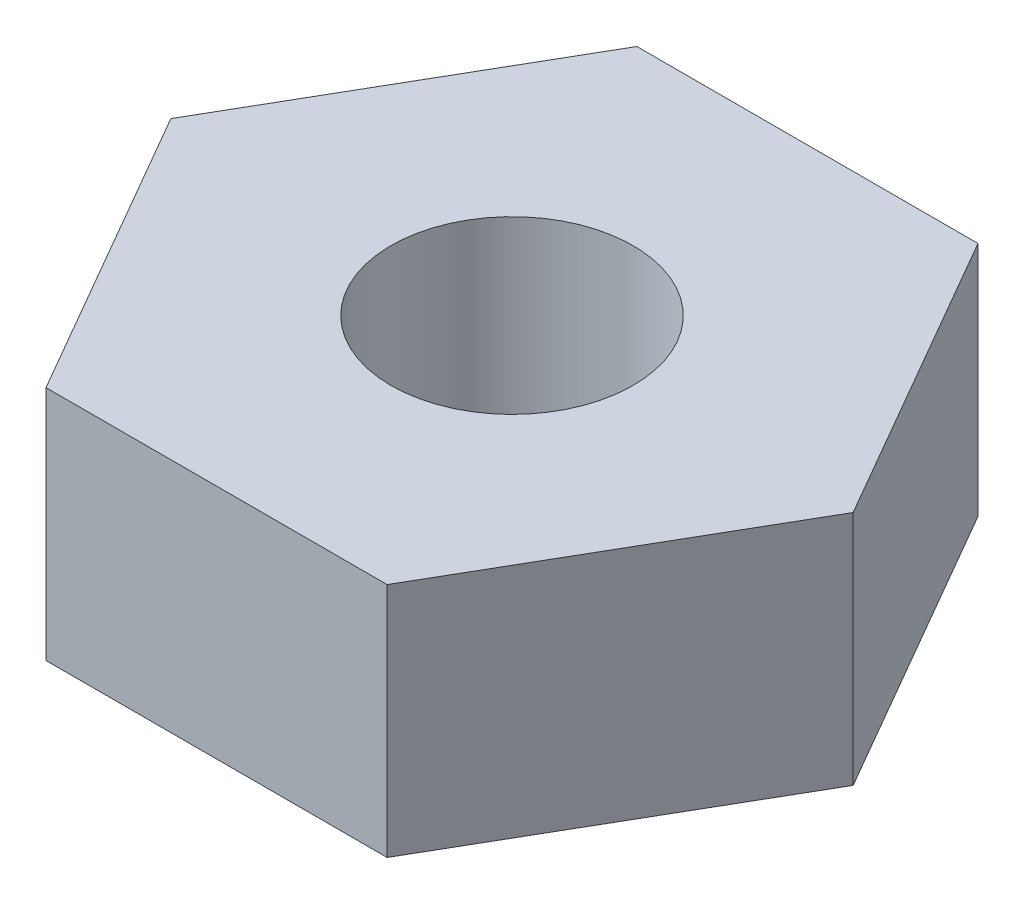
ISO-10303-21;
HEADER;
FILE_DESCRIPTION(('STEP AP214'),'2;1');
FILE_NAME('part.step','',(''),(''),'','','');
FILE_SCHEMA(('AUTOMOTIVE_DESIGN { 1 0 10303 214 1 1 1 1 }'));
ENDSEC;
DATA;
#1=APPLICATION_CONTEXT('core data for automotive mechanical design processes');
#2=APPLICATION_PROTOCOL_DEFINITION('international standard','automotive_design',2000,#1);
#3=PRODUCT_CONTEXT('',#1,'mechanical');
#4=PRODUCT('Part','Part','',(#3));
#5=PRODUCT_RELATED_PRODUCT_CATEGORY('part','',(#4));
#6=PRODUCT_DEFINITION_FORMATION('','',#4);
#7=PRODUCT_DEFINITION_CONTEXT('part definition',#1,'design');
#8=PRODUCT_DEFINITION('design','',#6,#7);
#9=PRODUCT_DEFINITION_SHAPE('','',#8);
#10=(LENGTH_UNIT() NAMED_UNIT(*) SI_UNIT(.MILLI.,.METRE.));
#11=(NAMED_UNIT(*) PLANE_ANGLE_UNIT() SI_UNIT($,.RADIAN.));
#12=(NAMED_UNIT(*) SI_UNIT($,.STERADIAN.) SOLID_ANGLE_UNIT());
#13=UNCERTAINTY_MEASURE_WITH_UNIT(LENGTH_MEASURE(1.E-05),#10,'distance_accuracy_value','');
#14=(GEOMETRIC_REPRESENTATION_CONTEXT(3) GLOBAL_UNCERTAINTY_ASSIGNED_CONTEXT((#13)) GLOBAL_UNIT_ASSIGNED_CONTEXT((#10,
#11,#12)) REPRESENTATION_CONTEXT('',''));
#15=CARTESIAN_POINT('',(0.,0.,0.));
#16=DIRECTION('',(0.,0.,1.));
#17=DIRECTION('',(1.,0.,0.));
#18=AXIS2_PLACEMENT_3D('',#15,#16,#17);
#19=CARTESIAN_POINT('',(-1.44337567297406,2.,-2.5));
#20=DIRECTION('',(0.,1.,0.));
#21=DIRECTION('',(0.,0.,1.));
#22=AXIS2_PLACEMENT_3D('',#19,#20,#21);
#23=PLANE('',#22);
#24=DIRECTION('',(-1.,0.,0.));
#25=VECTOR('',#24,1.);
#26=CARTESIAN_POINT('',(1.44337567297407,2.,-2.5));
#27=LINE('',#26,#25);
#28=CARTESIAN_POINT('',(1.44337567297407,2.,-2.5));
#29=VERTEX_POINT('',#28);
#30=CARTESIAN_POINT('',(-1.44337567297406,2.,-2.5));
#31=VERTEX_POINT('',#30);
#32=EDGE_CURVE('E132',#29,#31,#27,.T.);
#33=ORIENTED_EDGE('',*,*,#32,.T.);
#34=DIRECTION('',(-0.5,0.,0.866025403784439));
#35=VECTOR('',#34,1.);
#36=CARTESIAN_POINT('',(-1.44337567297406,2.,-2.5));
#37=LINE('',#36,#35);
#38=CARTESIAN_POINT('',(-2.88675134594813,2.,0.));
#39=VERTEX_POINT('',#38);
#40=EDGE_CURVE('E90',#31,#39,#37,.T.);
#41=ORIENTED_EDGE('',*,*,#40,.T.);
#42=DIRECTION('',(0.5,0.,0.866025403784439));
#43=VECTOR('',#42,1.);
#44=CARTESIAN_POINT('',(-2.88675134594813,2.,0.));
#45=LINE('',#44,#43);
#46=CARTESIAN_POINT('',(-1.44337567297407,2.,2.5));
#47=VERTEX_POINT('',#46);
#48=EDGE_CURVE('E103',#39,#47,#45,.T.);
#49=ORIENTED_EDGE('',*,*,#48,.T.);
#50=DIRECTION('',(1.,0.,0.));
#51=VECTOR('',#50,1.);
#52=CARTESIAN_POINT('',(-1.44337567297407,2.,2.5));
#53=LINE('',#52,#51);
#54=CARTESIAN_POINT('',(1.44337567297406,2.,2.5));
#55=VERTEX_POINT('',#54);
#56=EDGE_CURVE('E97',#47,#55,#53,.T.);
#57=ORIENTED_EDGE('',*,*,#56,.T.);
#58=DIRECTION('',(0.5,0.,-0.866025403784439));
#59=VECTOR('',#58,1.);
#60=CARTESIAN_POINT('',(1.44337567297406,2.,2.5));
#61=LINE('',#60,#59);
#62=CARTESIAN_POINT('',(2.88675134594813,2.,0.));
#63=VERTEX_POINT('',#62);
#64=EDGE_CURVE('E101',#55,#63,#61,.T.);
#65=ORIENTED_EDGE('',*,*,#64,.T.);
#66=DIRECTION('',(-0.5,0.,-0.866025403784439));
#67=VECTOR('',#66,1.);
#68=CARTESIAN_POINT('',(2.88675134594813,2.,0.));
#69=LINE('',#68,#67);
#70=EDGE_CURVE('E53',#63,#29,#69,.T.);
#71=ORIENTED_EDGE('',*,*,#70,.T.);
#72=EDGE_LOOP('',(#33,#41,#49,#57,#65,#71));
#73=FACE_BOUND('',#72,.T.);
#74=CARTESIAN_POINT('',(0.,2.,0.));
#75=DIRECTION('',(0.,1.,0.));
#76=DIRECTION('',(0.,0.,1.));
#77=AXIS2_PLACEMENT_3D('',#74,#75,#76);
#78=CIRCLE('',#77,1.025);
#79=CARTESIAN_POINT('',(0.,2.,1.025));
#80=VERTEX_POINT('',#79);
#81=EDGE_CURVE('E125',#80,#80,#78,.T.);
#82=ORIENTED_EDGE('',*,*,#81,.F.);
#83=EDGE_LOOP('',(#82));
#84=FACE_BOUND('',#83,.T.);
#85=ADVANCED_FACE('F36',(#73,#84),#23,.T.);
#86=CARTESIAN_POINT('',(-1.44337567297406,0.,-2.5));
#87=DIRECTION('',(0.,1.,0.));
#88=DIRECTION('',(0.,0.,1.));
#89=AXIS2_PLACEMENT_3D('',#86,#87,#88);
#90=PLANE('',#89);
#91=DIRECTION('',(-1.,0.,0.));
#92=VECTOR('',#91,1.);
#93=CARTESIAN_POINT('',(1.44337567297407,0.,-2.5));
#94=LINE('',#93,#92);
#95=CARTESIAN_POINT('',(1.44337567297407,0.,-2.5));
#96=VERTEX_POINT('',#95);
#97=CARTESIAN_POINT('',(-1.44337567297406,0.,-2.5));
#98=VERTEX_POINT('',#97);
#99=EDGE_CURVE('E121',#96,#98,#94,.T.);
#100=ORIENTED_EDGE('',*,*,#99,.F.);
#101=DIRECTION('',(-0.5,0.,-0.866025403784439));
#102=VECTOR('',#101,1.);
#103=CARTESIAN_POINT('',(2.88675134594813,0.,0.));
#104=LINE('',#103,#102);
#105=CARTESIAN_POINT('',(2.88675134594813,0.,0.));
#106=VERTEX_POINT('',#105);
#107=EDGE_CURVE('E82',#106,#96,#104,.T.);
#108=ORIENTED_EDGE('',*,*,#107,.F.);
#109=DIRECTION('',(0.5,0.,-0.866025403784439));
#110=VECTOR('',#109,1.);
#111=CARTESIAN_POINT('',(1.44337567297406,0.,2.5));
#112=LINE('',#111,#110);
#113=CARTESIAN_POINT('',(1.44337567297406,0.,2.5));
#114=VERTEX_POINT('',#113);
#115=EDGE_CURVE('E76',#114,#106,#112,.T.);
#116=ORIENTED_EDGE('',*,*,#115,.F.);
#117=DIRECTION('',(1.,0.,0.));
#118=VECTOR('',#117,1.);
#119=CARTESIAN_POINT('',(-1.44337567297407,0.,2.5));
#120=LINE('',#119,#118);
#121=CARTESIAN_POINT('',(-1.44337567297407,0.,2.5));
#122=VERTEX_POINT('',#121);
#123=EDGE_CURVE('E111',#122,#114,#120,.T.);
#124=ORIENTED_EDGE('',*,*,#123,.F.);
#125=DIRECTION('',(0.5,0.,0.866025403784439));
#126=VECTOR('',#125,1.);
#127=CARTESIAN_POINT('',(-2.88675134594813,0.,0.));
#128=LINE('',#127,#126);
#129=CARTESIAN_POINT('',(-2.88675134594813,0.,0.));
#130=VERTEX_POINT('',#129);
#131=EDGE_CURVE('E127',#130,#122,#128,.T.);
#132=ORIENTED_EDGE('',*,*,#131,.F.);
#133=DIRECTION('',(-0.5,0.,0.866025403784439));
#134=VECTOR('',#133,1.);
#135=CARTESIAN_POINT('',(-1.44337567297406,0.,-2.5));
#136=LINE('',#135,#134);
#137=EDGE_CURVE('E124',#98,#130,#136,.T.);
#138=ORIENTED_EDGE('',*,*,#137,.F.);
#139=EDGE_LOOP('',(#100,#108,#116,#124,#132,#138));
#140=FACE_BOUND('',#139,.T.);
#141=CARTESIAN_POINT('',(0.,0.,0.));
#142=DIRECTION('',(0.,1.,0.));
#143=DIRECTION('',(0.,0.,1.));
#144=AXIS2_PLACEMENT_3D('',#141,#142,#143);
#145=CIRCLE('',#144,1.025);
#146=CARTESIAN_POINT('',(0.,0.,1.025));
#147=VERTEX_POINT('',#146);
#148=EDGE_CURVE('E227',#147,#147,#145,.T.);
#149=ORIENTED_EDGE('',*,*,#148,.T.);
#150=EDGE_LOOP('',(#149));
#151=FACE_BOUND('',#150,.T.);
#152=ADVANCED_FACE('F141',(#140,#151),#90,.F.);
#153=CARTESIAN_POINT('',(1.44337567297407,2.,-2.5));
#154=DIRECTION('',(0.,0.,1.));
#155=DIRECTION('',(1.,0.,0.));
#156=AXIS2_PLACEMENT_3D('',#153,#154,#155);
#157=PLANE('',#156);
#158=ORIENTED_EDGE('',*,*,#99,.T.);
#159=DIRECTION('',(0.,-1.,0.));
#160=VECTOR('',#159,1.);
#161=CARTESIAN_POINT('',(-1.44337567297406,2.,-2.5));
#162=LINE('',#161,#160);
#163=EDGE_CURVE('E11',#31,#98,#162,.T.);
#164=ORIENTED_EDGE('',*,*,#163,.F.);
#165=ORIENTED_EDGE('',*,*,#32,.F.);
#166=DIRECTION('',(0.,-1.,0.));
#167=VECTOR('',#166,1.);
#168=CARTESIAN_POINT('',(1.44337567297407,2.,-2.5));
#169=LINE('',#168,#167);
#170=EDGE_CURVE('E117',#29,#96,#169,.T.);
#171=ORIENTED_EDGE('',*,*,#170,.T.);
#172=EDGE_LOOP('',(#158,#164,#165,#171));
#173=FACE_BOUND('',#172,.T.);
#174=ADVANCED_FACE('F38',(#173),#157,.F.);
#175=CARTESIAN_POINT('',(-1.44337567297406,2.,-2.5));
#176=DIRECTION('',(0.866025403784439,0.,0.5));
#177=DIRECTION('',(0.5,0.,-0.866025403784439));
#178=AXIS2_PLACEMENT_3D('',#175,#176,#177);
#179=PLANE('',#178);
#180=ORIENTED_EDGE('',*,*,#137,.T.);
#181=DIRECTION('',(0.,-1.,0.));
#182=VECTOR('',#181,1.);
#183=CARTESIAN_POINT('',(-2.88675134594813,2.,0.));
#184=LINE('',#183,#182);
#185=EDGE_CURVE('E45',#39,#130,#184,.T.);
#186=ORIENTED_EDGE('',*,*,#185,.F.);
#187=ORIENTED_EDGE('',*,*,#40,.F.);
#188=ORIENTED_EDGE('',*,*,#163,.T.);
#189=EDGE_LOOP('',(#180,#186,#187,#188));
#190=FACE_BOUND('',#189,.T.);
#191=ADVANCED_FACE('F166',(#190),#179,.F.);
#192=CARTESIAN_POINT('',(-2.88675134594813,2.,0.));
#193=DIRECTION('',(0.866025403784439,0.,-0.5));
#194=DIRECTION('',(-0.5,0.,-0.866025403784439));
#195=AXIS2_PLACEMENT_3D('',#192,#193,#194);
#196=PLANE('',#195);
#197=ORIENTED_EDGE('',*,*,#131,.T.);
#198=DIRECTION('',(0.,-1.,0.));
#199=VECTOR('',#198,1.);
#200=CARTESIAN_POINT('',(-1.44337567297407,2.,2.5));
#201=LINE('',#200,#199);
#202=EDGE_CURVE('E112',#47,#122,#201,.T.);
#203=ORIENTED_EDGE('',*,*,#202,.F.);
#204=ORIENTED_EDGE('',*,*,#48,.F.);
#205=ORIENTED_EDGE('',*,*,#185,.T.);
#206=EDGE_LOOP('',(#197,#203,#204,#205));
#207=FACE_BOUND('',#206,.T.);
#208=ADVANCED_FACE('F138',(#207),#196,.F.);
#209=CARTESIAN_POINT('',(-1.44337567297407,2.,2.5));
#210=DIRECTION('',(0.,0.,-1.));
#211=DIRECTION('',(-1.,0.,0.));
#212=AXIS2_PLACEMENT_3D('',#209,#210,#211);
#213=PLANE('',#212);
#214=ORIENTED_EDGE('',*,*,#123,.T.);
#215=DIRECTION('',(0.,-1.,0.));
#216=VECTOR('',#215,1.);
#217=CARTESIAN_POINT('',(1.44337567297406,2.,2.5));
#218=LINE('',#217,#216);
#219=EDGE_CURVE('E108',#55,#114,#218,.T.);
#220=ORIENTED_EDGE('',*,*,#219,.F.);
#221=ORIENTED_EDGE('',*,*,#56,.F.);
#222=ORIENTED_EDGE('',*,*,#202,.T.);
#223=EDGE_LOOP('',(#214,#220,#221,#222));
#224=FACE_BOUND('',#223,.T.);
#225=ADVANCED_FACE('F109',(#224),#213,.F.);
#226=CARTESIAN_POINT('',(1.44337567297406,2.,2.5));
#227=DIRECTION('',(-0.866025403784439,0.,-0.5));
#228=DIRECTION('',(-0.5,0.,0.866025403784439));
#229=AXIS2_PLACEMENT_3D('',#226,#227,#228);
#230=PLANE('',#229);
#231=ORIENTED_EDGE('',*,*,#115,.T.);
#232=DIRECTION('',(0.,-1.,0.));
#233=VECTOR('',#232,1.);
#234=CARTESIAN_POINT('',(2.88675134594813,2.,0.));
#235=LINE('',#234,#233);
#236=EDGE_CURVE('E113',#63,#106,#235,.T.);
#237=ORIENTED_EDGE('',*,*,#236,.F.);
#238=ORIENTED_EDGE('',*,*,#64,.F.);
#239=ORIENTED_EDGE('',*,*,#219,.T.);
#240=EDGE_LOOP('',(#231,#237,#238,#239));
#241=FACE_BOUND('',#240,.T.);
#242=ADVANCED_FACE('F115',(#241),#230,.F.);
#243=CARTESIAN_POINT('',(2.88675134594813,2.,0.));
#244=DIRECTION('',(-0.866025403784439,0.,0.5));
#245=DIRECTION('',(0.5,0.,0.866025403784439));
#246=AXIS2_PLACEMENT_3D('',#243,#244,#245);
#247=PLANE('',#246);
#248=ORIENTED_EDGE('',*,*,#107,.T.);
#249=ORIENTED_EDGE('',*,*,#170,.F.);
#250=ORIENTED_EDGE('',*,*,#70,.F.);
#251=ORIENTED_EDGE('',*,*,#236,.T.);
#252=EDGE_LOOP('',(#248,#249,#250,#251));
#253=FACE_BOUND('',#252,.T.);
#254=ADVANCED_FACE('F146',(#253),#247,.F.);
#255=CARTESIAN_POINT('',(0.,2.,0.));
#256=DIRECTION('',(0.,-1.,0.));
#257=DIRECTION('',(0.,0.,-1.));
#258=AXIS2_PLACEMENT_3D('',#255,#256,#257);
#259=CYLINDRICAL_SURFACE('',#258,1.025);
#260=ORIENTED_EDGE('',*,*,#81,.T.);
#261=EDGE_LOOP('',(#260));
#262=FACE_BOUND('',#261,.T.);
#263=ORIENTED_EDGE('',*,*,#148,.F.);
#264=EDGE_LOOP('',(#263));
#265=FACE_BOUND('',#264,.T.);
#266=ADVANCED_FACE('F148',(#262,#265),#259,.F.);
#267=CLOSED_SHELL('',(#85,#152,#174,#191,#208,#225,#242,#254,#266));
#268=MANIFOLD_SOLID_BREP('B2',#267);
#269=ADVANCED_BREP_SHAPE_REPRESENTATION('',(#18,#268),#14);
#270=SHAPE_DEFINITION_REPRESENTATION(#9,#269);
ENDSEC;
END-ISO-10303-21;
